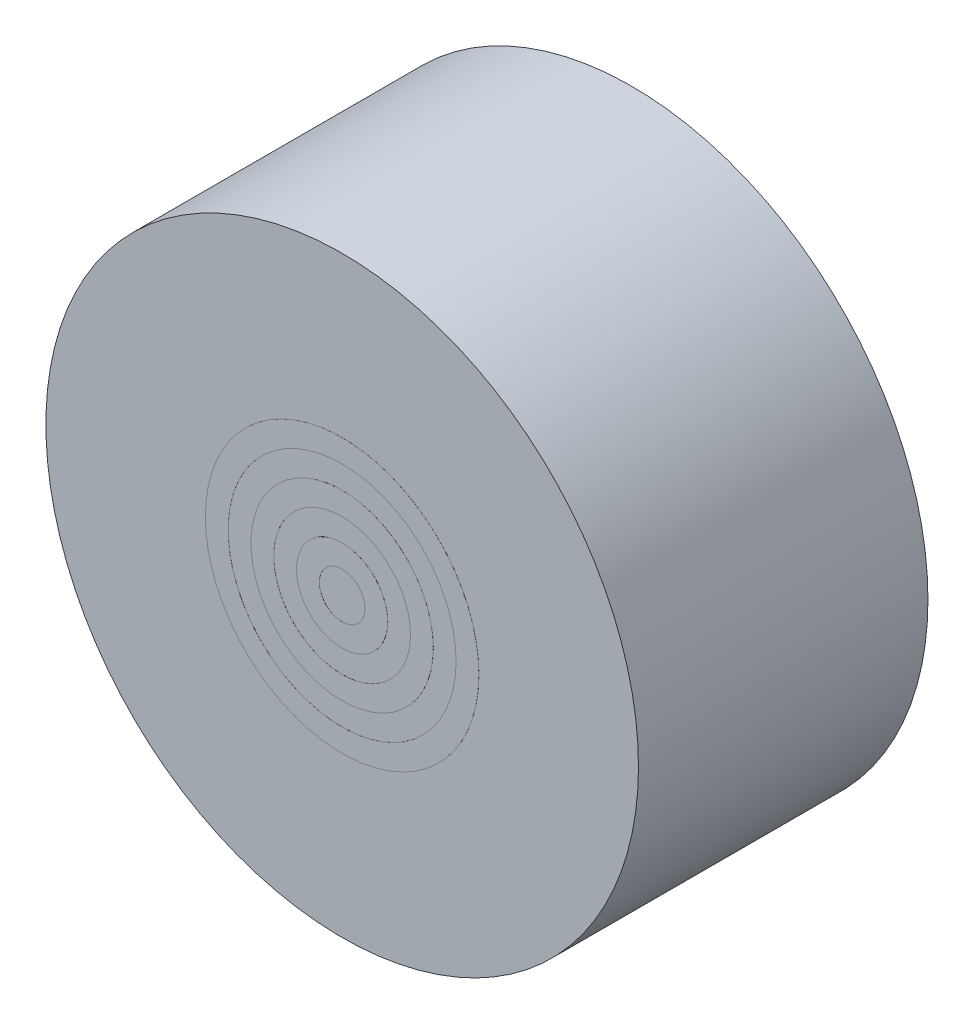
ISO-10303-21;
HEADER;
FILE_DESCRIPTION(('STEP AP214'),'2;1');
FILE_NAME('part.step','',(''),(''),'','','');
FILE_SCHEMA(('AUTOMOTIVE_DESIGN { 1 0 10303 214 1 1 1 1 }'));
ENDSEC;
DATA;
#1=APPLICATION_CONTEXT('core data for automotive mechanical design processes');
#2=APPLICATION_PROTOCOL_DEFINITION('international standard','automotive_design',2000,#1);
#3=PRODUCT_CONTEXT('',#1,'mechanical');
#4=PRODUCT('Part','Part','',(#3));
#5=PRODUCT_RELATED_PRODUCT_CATEGORY('part','',(#4));
#6=PRODUCT_DEFINITION_FORMATION('','',#4);
#7=PRODUCT_DEFINITION_CONTEXT('part definition',#1,'design');
#8=PRODUCT_DEFINITION('design','',#6,#7);
#9=PRODUCT_DEFINITION_SHAPE('','',#8);
#10=(LENGTH_UNIT() NAMED_UNIT(*) SI_UNIT(.MILLI.,.METRE.));
#11=(NAMED_UNIT(*) PLANE_ANGLE_UNIT() SI_UNIT($,.RADIAN.));
#12=(NAMED_UNIT(*) SI_UNIT($,.STERADIAN.) SOLID_ANGLE_UNIT());
#13=UNCERTAINTY_MEASURE_WITH_UNIT(LENGTH_MEASURE(1.E-05),#10,'distance_accuracy_value','');
#14=(GEOMETRIC_REPRESENTATION_CONTEXT(3) GLOBAL_UNCERTAINTY_ASSIGNED_CONTEXT((#13)) GLOBAL_UNIT_ASSIGNED_CONTEXT((#10,
#11,#12)) REPRESENTATION_CONTEXT('',''));
#15=CARTESIAN_POINT('',(0.,0.,0.));
#16=DIRECTION('',(0.,0.,1.));
#17=DIRECTION('',(1.,0.,0.));
#18=AXIS2_PLACEMENT_3D('',#15,#16,#17);
#19=CARTESIAN_POINT('',(0.,0.,6.351));
#20=DIRECTION('',(0.,0.,1.));
#21=DIRECTION('',(1.,0.,0.));
#22=AXIS2_PLACEMENT_3D('',#19,#20,#21);
#23=PLANE('',#22);
#24=CARTESIAN_POINT('',(0.,0.,6.351));
#25=DIRECTION('',(0.,0.,1.));
#26=DIRECTION('',(1.,0.,0.));
#27=AXIS2_PLACEMENT_3D('',#24,#25,#26);
#28=CIRCLE('',#27,1.);
#29=CARTESIAN_POINT('',(1.,0.,6.351));
#30=VERTEX_POINT('',#29);
#31=EDGE_CURVE('E83',#30,#30,#28,.T.);
#32=ORIENTED_EDGE('',*,*,#31,.T.);
#33=EDGE_LOOP('',(#32));
#34=FACE_BOUND('',#33,.T.);
#35=CARTESIAN_POINT('',(0.,0.,6.351));
#36=DIRECTION('',(0.,0.,1.));
#37=DIRECTION('',(1.,0.,0.));
#38=AXIS2_PLACEMENT_3D('',#35,#36,#37);
#39=CIRCLE('',#38,0.5);
#40=CARTESIAN_POINT('',(0.5,0.,6.351));
#41=VERTEX_POINT('',#40);
#42=EDGE_CURVE('E80',#41,#41,#39,.T.);
#43=ORIENTED_EDGE('',*,*,#42,.F.);
#44=EDGE_LOOP('',(#43));
#45=FACE_BOUND('',#44,.T.);
#46=ADVANCED_FACE('F44',(#34,#45),#23,.T.);
#47=CARTESIAN_POINT('',(0.,0.,6.351));
#48=DIRECTION('',(0.,0.,-1.));
#49=DIRECTION('',(-1.,0.,0.));
#50=AXIS2_PLACEMENT_3D('',#47,#48,#49);
#51=CYLINDRICAL_SURFACE('',#50,1.);
#52=CARTESIAN_POINT('',(0.,0.,6.35));
#53=DIRECTION('',(0.,0.,1.));
#54=DIRECTION('',(1.,0.,0.));
#55=AXIS2_PLACEMENT_3D('',#52,#53,#54);
#56=CIRCLE('',#55,1.);
#57=CARTESIAN_POINT('',(1.,0.,6.35));
#58=VERTEX_POINT('',#57);
#59=EDGE_CURVE('E64',#58,#58,#56,.T.);
#60=ORIENTED_EDGE('',*,*,#59,.T.);
#61=EDGE_LOOP('',(#60));
#62=FACE_BOUND('',#61,.T.);
#63=ORIENTED_EDGE('',*,*,#31,.F.);
#64=EDGE_LOOP('',(#63));
#65=FACE_BOUND('',#64,.T.);
#66=ADVANCED_FACE('F141',(#62,#65),#51,.T.);
#67=CARTESIAN_POINT('',(0.,0.,6.351));
#68=DIRECTION('',(0.,0.,-1.));
#69=DIRECTION('',(-1.,0.,0.));
#70=AXIS2_PLACEMENT_3D('',#67,#68,#69);
#71=CYLINDRICAL_SURFACE('',#70,0.5);
#72=CARTESIAN_POINT('',(0.,0.,6.35));
#73=DIRECTION('',(0.,0.,1.));
#74=DIRECTION('',(1.,0.,0.));
#75=AXIS2_PLACEMENT_3D('',#72,#73,#74);
#76=CIRCLE('',#75,0.5);
#77=CARTESIAN_POINT('',(0.5,0.,6.35));
#78=VERTEX_POINT('',#77);
#79=EDGE_CURVE('E11',#78,#78,#76,.T.);
#80=ORIENTED_EDGE('',*,*,#79,.F.);
#81=EDGE_LOOP('',(#80));
#82=FACE_BOUND('',#81,.T.);
#83=ORIENTED_EDGE('',*,*,#42,.T.);
#84=EDGE_LOOP('',(#83));
#85=FACE_BOUND('',#84,.T.);
#86=ADVANCED_FACE('F146',(#82,#85),#71,.F.);
#87=CARTESIAN_POINT('',(0.,0.,6.35));
#88=DIRECTION('',(0.,0.,1.));
#89=DIRECTION('',(1.,0.,0.));
#90=AXIS2_PLACEMENT_3D('',#87,#88,#89);
#91=PLANE('',#90);
#92=ORIENTED_EDGE('',*,*,#59,.F.);
#93=EDGE_LOOP('',(#92));
#94=FACE_BOUND('',#93,.T.);
#95=CARTESIAN_POINT('',(0.,0.,6.35));
#96=DIRECTION('',(0.,0.,1.));
#97=DIRECTION('',(1.,0.,0.));
#98=AXIS2_PLACEMENT_3D('',#95,#96,#97);
#99=CIRCLE('',#98,1.5);
#100=CARTESIAN_POINT('',(1.5,0.,6.35));
#101=VERTEX_POINT('',#100);
#102=EDGE_CURVE('E53',#101,#101,#99,.T.);
#103=ORIENTED_EDGE('',*,*,#102,.T.);
#104=EDGE_LOOP('',(#103));
#105=FACE_BOUND('',#104,.T.);
#106=ADVANCED_FACE('F151',(#94,#105),#91,.T.);
#107=CARTESIAN_POINT('',(0.,0.,6.351));
#108=DIRECTION('',(0.,0.,-1.));
#109=DIRECTION('',(-1.,0.,0.));
#110=AXIS2_PLACEMENT_3D('',#107,#108,#109);
#111=CYLINDRICAL_SURFACE('',#110,2.);
#112=CARTESIAN_POINT('',(0.,0.,6.35));
#113=DIRECTION('',(0.,0.,1.));
#114=DIRECTION('',(1.,0.,0.));
#115=AXIS2_PLACEMENT_3D('',#112,#113,#114);
#116=CIRCLE('',#115,2.);
#117=CARTESIAN_POINT('',(2.,0.,6.35));
#118=VERTEX_POINT('',#117);
#119=EDGE_CURVE('E63',#118,#118,#116,.T.);
#120=ORIENTED_EDGE('',*,*,#119,.T.);
#121=EDGE_LOOP('',(#120));
#122=FACE_BOUND('',#121,.T.);
#123=CARTESIAN_POINT('',(0.,0.,6.351));
#124=DIRECTION('',(0.,0.,1.));
#125=DIRECTION('',(1.,0.,0.));
#126=AXIS2_PLACEMENT_3D('',#123,#124,#125);
#127=CIRCLE('',#126,2.);
#128=CARTESIAN_POINT('',(2.,0.,6.351));
#129=VERTEX_POINT('',#128);
#130=EDGE_CURVE('E75',#129,#129,#127,.T.);
#131=ORIENTED_EDGE('',*,*,#130,.F.);
#132=EDGE_LOOP('',(#131));
#133=FACE_BOUND('',#132,.T.);
#134=ADVANCED_FACE('F153',(#122,#133),#111,.T.);
#135=CARTESIAN_POINT('',(0.,0.,6.351));
#136=DIRECTION('',(0.,0.,1.));
#137=DIRECTION('',(1.,0.,0.));
#138=AXIS2_PLACEMENT_3D('',#135,#136,#137);
#139=PLANE('',#138);
#140=ORIENTED_EDGE('',*,*,#130,.T.);
#141=EDGE_LOOP('',(#140));
#142=FACE_BOUND('',#141,.T.);
#143=CARTESIAN_POINT('',(0.,0.,6.351));
#144=DIRECTION('',(0.,0.,1.));
#145=DIRECTION('',(1.,0.,0.));
#146=AXIS2_PLACEMENT_3D('',#143,#144,#145);
#147=CIRCLE('',#146,1.5);
#148=CARTESIAN_POINT('',(1.5,0.,6.351));
#149=VERTEX_POINT('',#148);
#150=EDGE_CURVE('E69',#149,#149,#147,.T.);
#151=ORIENTED_EDGE('',*,*,#150,.F.);
#152=EDGE_LOOP('',(#151));
#153=FACE_BOUND('',#152,.T.);
#154=ADVANCED_FACE('F156',(#142,#153),#139,.T.);
#155=CARTESIAN_POINT('',(0.,0.,6.351));
#156=DIRECTION('',(0.,0.,-1.));
#157=DIRECTION('',(-1.,0.,0.));
#158=AXIS2_PLACEMENT_3D('',#155,#156,#157);
#159=CYLINDRICAL_SURFACE('',#158,1.5);
#160=ORIENTED_EDGE('',*,*,#102,.F.);
#161=EDGE_LOOP('',(#160));
#162=FACE_BOUND('',#161,.T.);
#163=ORIENTED_EDGE('',*,*,#150,.T.);
#164=EDGE_LOOP('',(#163));
#165=FACE_BOUND('',#164,.T.);
#166=ADVANCED_FACE('F159',(#162,#165),#159,.F.);
#167=ORIENTED_EDGE('',*,*,#79,.T.);
#168=EDGE_LOOP('',(#167));
#169=FACE_BOUND('',#168,.T.);
#170=ADVANCED_FACE('F163',(#169),#91,.T.);
#171=ORIENTED_EDGE('',*,*,#119,.F.);
#172=EDGE_LOOP('',(#171));
#173=FACE_BOUND('',#172,.T.);
#174=CARTESIAN_POINT('',(0.,0.,6.35));
#175=DIRECTION('',(0.,0.,1.));
#176=DIRECTION('',(1.,0.,0.));
#177=AXIS2_PLACEMENT_3D('',#174,#175,#176);
#178=CIRCLE('',#177,2.5);
#179=CARTESIAN_POINT('',(2.5,0.,6.35));
#180=VERTEX_POINT('',#179);
#181=EDGE_CURVE('E48',#180,#180,#178,.T.);
#182=ORIENTED_EDGE('',*,*,#181,.T.);
#183=EDGE_LOOP('',(#182));
#184=FACE_BOUND('',#183,.T.);
#185=ADVANCED_FACE('F92',(#173,#184),#91,.T.);
#186=CARTESIAN_POINT('',(0.,0.,6.351));
#187=DIRECTION('',(0.,0.,-1.));
#188=DIRECTION('',(-1.,0.,0.));
#189=AXIS2_PLACEMENT_3D('',#186,#187,#188);
#190=CYLINDRICAL_SURFACE('',#189,3.);
#191=CARTESIAN_POINT('',(0.,0.,6.35));
#192=DIRECTION('',(0.,0.,1.));
#193=DIRECTION('',(1.,0.,0.));
#194=AXIS2_PLACEMENT_3D('',#191,#192,#193);
#195=CIRCLE('',#194,3.);
#196=CARTESIAN_POINT('',(3.,0.,6.35));
#197=VERTEX_POINT('',#196);
#198=EDGE_CURVE('E113',#197,#197,#195,.T.);
#199=ORIENTED_EDGE('',*,*,#198,.T.);
#200=EDGE_LOOP('',(#199));
#201=FACE_BOUND('',#200,.T.);
#202=CARTESIAN_POINT('',(0.,0.,6.351));
#203=DIRECTION('',(0.,0.,1.));
#204=DIRECTION('',(1.,0.,0.));
#205=AXIS2_PLACEMENT_3D('',#202,#203,#204);
#206=CIRCLE('',#205,3.);
#207=CARTESIAN_POINT('',(3.,0.,6.351));
#208=VERTEX_POINT('',#207);
#209=EDGE_CURVE('E76',#208,#208,#206,.T.);
#210=ORIENTED_EDGE('',*,*,#209,.F.);
#211=EDGE_LOOP('',(#210));
#212=FACE_BOUND('',#211,.T.);
#213=ADVANCED_FACE('F165',(#201,#212),#190,.T.);
#214=CARTESIAN_POINT('',(0.,0.,6.351));
#215=DIRECTION('',(0.,0.,1.));
#216=DIRECTION('',(1.,0.,0.));
#217=AXIS2_PLACEMENT_3D('',#214,#215,#216);
#218=PLANE('',#217);
#219=ORIENTED_EDGE('',*,*,#209,.T.);
#220=EDGE_LOOP('',(#219));
#221=FACE_BOUND('',#220,.T.);
#222=CARTESIAN_POINT('',(0.,0.,6.351));
#223=DIRECTION('',(0.,0.,1.));
#224=DIRECTION('',(1.,0.,0.));
#225=AXIS2_PLACEMENT_3D('',#222,#223,#224);
#226=CIRCLE('',#225,2.5);
#227=CARTESIAN_POINT('',(2.5,0.,6.351));
#228=VERTEX_POINT('',#227);
#229=EDGE_CURVE('E102',#228,#228,#226,.T.);
#230=ORIENTED_EDGE('',*,*,#229,.F.);
#231=EDGE_LOOP('',(#230));
#232=FACE_BOUND('',#231,.T.);
#233=ADVANCED_FACE('F98',(#221,#232),#218,.T.);
#234=CARTESIAN_POINT('',(0.,0.,6.351));
#235=DIRECTION('',(0.,0.,-1.));
#236=DIRECTION('',(-1.,0.,0.));
#237=AXIS2_PLACEMENT_3D('',#234,#235,#236);
#238=CYLINDRICAL_SURFACE('',#237,2.5);
#239=ORIENTED_EDGE('',*,*,#181,.F.);
#240=EDGE_LOOP('',(#239));
#241=FACE_BOUND('',#240,.T.);
#242=ORIENTED_EDGE('',*,*,#229,.T.);
#243=EDGE_LOOP('',(#242));
#244=FACE_BOUND('',#243,.T.);
#245=ADVANCED_FACE('F94',(#241,#244),#238,.F.);
#246=ORIENTED_EDGE('',*,*,#198,.F.);
#247=EDGE_LOOP('',(#246));
#248=FACE_BOUND('',#247,.T.);
#249=CARTESIAN_POINT('',(0.,0.,6.35));
#250=DIRECTION('',(0.,0.,1.));
#251=DIRECTION('',(1.,0.,0.));
#252=AXIS2_PLACEMENT_3D('',#249,#250,#251);
#253=CIRCLE('',#252,6.5);
#254=CARTESIAN_POINT('',(6.5,0.,6.35));
#255=VERTEX_POINT('',#254);
#256=EDGE_CURVE('E118',#255,#255,#253,.T.);
#257=ORIENTED_EDGE('',*,*,#256,.T.);
#258=EDGE_LOOP('',(#257));
#259=FACE_BOUND('',#258,.T.);
#260=ADVANCED_FACE('F97',(#248,#259),#91,.T.);
#261=CARTESIAN_POINT('',(0.,0.,6.35));
#262=DIRECTION('',(0.,0.,-1.));
#263=DIRECTION('',(-1.,0.,0.));
#264=AXIS2_PLACEMENT_3D('',#261,#262,#263);
#265=CYLINDRICAL_SURFACE('',#264,6.5);
#266=ORIENTED_EDGE('',*,*,#256,.F.);
#267=EDGE_LOOP('',(#266));
#268=FACE_BOUND('',#267,.T.);
#269=CARTESIAN_POINT('',(0.,0.,0.));
#270=DIRECTION('',(0.,0.,1.));
#271=DIRECTION('',(1.,0.,0.));
#272=AXIS2_PLACEMENT_3D('',#269,#270,#271);
#273=CIRCLE('',#272,6.5);
#274=CARTESIAN_POINT('',(6.5,0.,0.));
#275=VERTEX_POINT('',#274);
#276=EDGE_CURVE('E124',#275,#275,#273,.T.);
#277=ORIENTED_EDGE('',*,*,#276,.T.);
#278=EDGE_LOOP('',(#277));
#279=FACE_BOUND('',#278,.T.);
#280=ADVANCED_FACE('F132',(#268,#279),#265,.T.);
#281=CARTESIAN_POINT('',(0.,0.,0.));
#282=DIRECTION('',(0.,0.,1.));
#283=DIRECTION('',(1.,0.,0.));
#284=AXIS2_PLACEMENT_3D('',#281,#282,#283);
#285=PLANE('',#284);
#286=ORIENTED_EDGE('',*,*,#276,.F.);
#287=EDGE_LOOP('',(#286));
#288=FACE_BOUND('',#287,.T.);
#289=ADVANCED_FACE('F46',(#288),#285,.F.);
#290=CLOSED_SHELL('',(#46,#66,#86,#106,#134,#154,#166,#170,#185,#213,#233,#245,#260,#280,#289));
#291=MANIFOLD_SOLID_BREP('B2',#290);
#292=ADVANCED_BREP_SHAPE_REPRESENTATION('',(#18,#291),#14);
#293=SHAPE_DEFINITION_REPRESENTATION(#9,#292);
ENDSEC;
END-ISO-10303-21;
